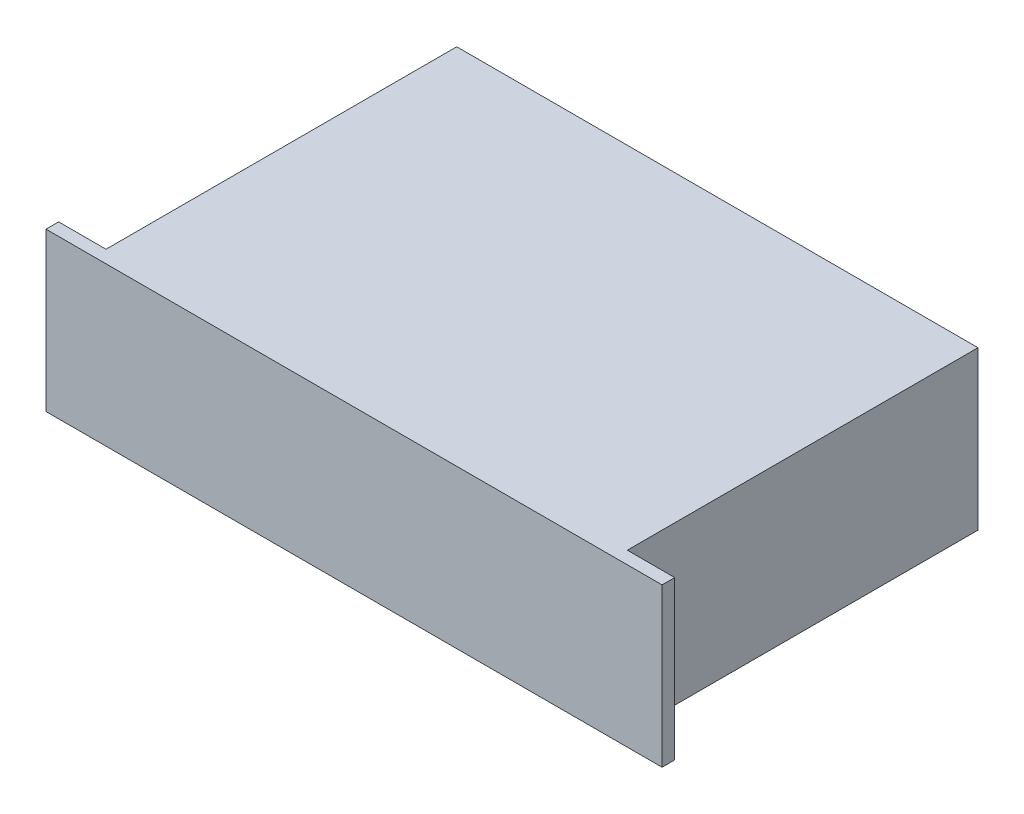
ISO-10303-21;
HEADER;
FILE_DESCRIPTION(('STEP AP214'),'2;1');
FILE_NAME('part.step','',(''),(''),'','','');
FILE_SCHEMA(('AUTOMOTIVE_DESIGN { 1 0 10303 214 1 1 1 1 }'));
ENDSEC;
DATA;
#1=APPLICATION_CONTEXT('core data for automotive mechanical design processes');
#2=APPLICATION_PROTOCOL_DEFINITION('international standard','automotive_design',2000,#1);
#3=PRODUCT_CONTEXT('',#1,'mechanical');
#4=PRODUCT('Part','Part','',(#3));
#5=PRODUCT_RELATED_PRODUCT_CATEGORY('part','',(#4));
#6=PRODUCT_DEFINITION_FORMATION('','',#4);
#7=PRODUCT_DEFINITION_CONTEXT('part definition',#1,'design');
#8=PRODUCT_DEFINITION('design','',#6,#7);
#9=PRODUCT_DEFINITION_SHAPE('','',#8);
#10=(LENGTH_UNIT() NAMED_UNIT(*) SI_UNIT(.MILLI.,.METRE.));
#11=(NAMED_UNIT(*) PLANE_ANGLE_UNIT() SI_UNIT($,.RADIAN.));
#12=(NAMED_UNIT(*) SI_UNIT($,.STERADIAN.) SOLID_ANGLE_UNIT());
#13=UNCERTAINTY_MEASURE_WITH_UNIT(LENGTH_MEASURE(1.E-05),#10,'distance_accuracy_value','');
#14=(GEOMETRIC_REPRESENTATION_CONTEXT(3) GLOBAL_UNCERTAINTY_ASSIGNED_CONTEXT((#13)) GLOBAL_UNIT_ASSIGNED_CONTEXT((#10,
#11,#12)) REPRESENTATION_CONTEXT('',''));
#15=CARTESIAN_POINT('',(0.,0.,0.));
#16=DIRECTION('',(0.,0.,1.));
#17=DIRECTION('',(1.,0.,0.));
#18=AXIS2_PLACEMENT_3D('',#15,#16,#17);
#19=CARTESIAN_POINT('',(0.,0.,0.));
#20=DIRECTION('',(0.,0.,1.));
#21=DIRECTION('',(1.,0.,0.));
#22=AXIS2_PLACEMENT_3D('',#19,#20,#21);
#23=PLANE('',#22);
#24=DIRECTION('',(0.,1.,0.));
#25=VECTOR('',#24,1.);
#26=CARTESIAN_POINT('',(15.,-50.,0.));
#27=LINE('',#26,#25);
#28=CARTESIAN_POINT('',(15.,-50.,0.));
#29=VERTEX_POINT('',#28);
#30=CARTESIAN_POINT('',(15.,0.,0.));
#31=VERTEX_POINT('',#30);
#32=EDGE_CURVE('E60',#29,#31,#27,.T.);
#33=ORIENTED_EDGE('',*,*,#32,.F.);
#34=DIRECTION('',(1.,0.,0.));
#35=VECTOR('',#34,1.);
#36=CARTESIAN_POINT('',(0.,-50.,0.));
#37=LINE('',#36,#35);
#38=CARTESIAN_POINT('',(0.,-50.,0.));
#39=VERTEX_POINT('',#38);
#40=EDGE_CURVE('E204',#39,#29,#37,.T.);
#41=ORIENTED_EDGE('',*,*,#40,.F.);
#42=DIRECTION('',(0.,-1.,0.));
#43=VECTOR('',#42,1.);
#44=CARTESIAN_POINT('',(0.,0.,0.));
#45=LINE('',#44,#43);
#46=CARTESIAN_POINT('',(0.,0.,0.));
#47=VERTEX_POINT('',#46);
#48=EDGE_CURVE('E189',#47,#39,#45,.T.);
#49=ORIENTED_EDGE('',*,*,#48,.F.);
#50=DIRECTION('',(-1.,0.,0.));
#51=VECTOR('',#50,1.);
#52=CARTESIAN_POINT('',(0.,0.,0.));
#53=LINE('',#52,#51);
#54=EDGE_CURVE('E208',#31,#47,#53,.T.);
#55=ORIENTED_EDGE('',*,*,#54,.F.);
#56=EDGE_LOOP('',(#33,#41,#49,#55));
#57=FACE_BOUND('',#56,.T.);
#58=ADVANCED_FACE('F37',(#57),#23,.F.);
#59=DIRECTION('',(0.,-1.,0.));
#60=VECTOR('',#59,1.);
#61=CARTESIAN_POINT('',(180.,-50.,0.));
#62=LINE('',#61,#60);
#63=CARTESIAN_POINT('',(180.,0.,0.));
#64=VERTEX_POINT('',#63);
#65=CARTESIAN_POINT('',(180.,-50.,0.));
#66=VERTEX_POINT('',#65);
#67=EDGE_CURVE('E168',#64,#66,#62,.T.);
#68=ORIENTED_EDGE('',*,*,#67,.F.);
#69=CARTESIAN_POINT('',(195.,0.,0.));
#70=VERTEX_POINT('',#69);
#71=EDGE_CURVE('E194',#70,#64,#53,.T.);
#72=ORIENTED_EDGE('',*,*,#71,.F.);
#73=DIRECTION('',(0.,1.,0.));
#74=VECTOR('',#73,1.);
#75=CARTESIAN_POINT('',(195.,0.,0.));
#76=LINE('',#75,#74);
#77=CARTESIAN_POINT('',(195.,-50.,0.));
#78=VERTEX_POINT('',#77);
#79=EDGE_CURVE('E206',#78,#70,#76,.T.);
#80=ORIENTED_EDGE('',*,*,#79,.F.);
#81=EDGE_CURVE('E203',#66,#78,#37,.T.);
#82=ORIENTED_EDGE('',*,*,#81,.F.);
#83=EDGE_LOOP('',(#68,#72,#80,#82));
#84=FACE_BOUND('',#83,.T.);
#85=ADVANCED_FACE('F225',(#84),#23,.F.);
#86=CARTESIAN_POINT('',(0.,0.,4.));
#87=DIRECTION('',(1.,0.,0.));
#88=DIRECTION('',(0.,0.,-1.));
#89=AXIS2_PLACEMENT_3D('',#86,#87,#88);
#90=PLANE('',#89);
#91=ORIENTED_EDGE('',*,*,#48,.T.);
#92=DIRECTION('',(0.,0.,-1.));
#93=VECTOR('',#92,1.);
#94=CARTESIAN_POINT('',(0.,-50.,4.));
#95=LINE('',#94,#93);
#96=CARTESIAN_POINT('',(0.,-50.,4.));
#97=VERTEX_POINT('',#96);
#98=EDGE_CURVE('E11',#97,#39,#95,.T.);
#99=ORIENTED_EDGE('',*,*,#98,.F.);
#100=DIRECTION('',(0.,-1.,0.));
#101=VECTOR('',#100,1.);
#102=CARTESIAN_POINT('',(0.,0.,4.));
#103=LINE('',#102,#101);
#104=CARTESIAN_POINT('',(0.,0.,4.));
#105=VERTEX_POINT('',#104);
#106=EDGE_CURVE('E190',#105,#97,#103,.T.);
#107=ORIENTED_EDGE('',*,*,#106,.F.);
#108=DIRECTION('',(0.,0.,-1.));
#109=VECTOR('',#108,1.);
#110=CARTESIAN_POINT('',(0.,0.,4.));
#111=LINE('',#110,#109);
#112=EDGE_CURVE('E200',#105,#47,#111,.T.);
#113=ORIENTED_EDGE('',*,*,#112,.T.);
#114=EDGE_LOOP('',(#91,#99,#107,#113));
#115=FACE_BOUND('',#114,.T.);
#116=ADVANCED_FACE('F39',(#115),#90,.F.);
#117=CARTESIAN_POINT('',(0.,-50.,4.));
#118=DIRECTION('',(0.,1.,0.));
#119=DIRECTION('',(0.,0.,1.));
#120=AXIS2_PLACEMENT_3D('',#117,#118,#119);
#121=PLANE('',#120);
#122=ORIENTED_EDGE('',*,*,#40,.T.);
#123=DIRECTION('',(0.,0.,1.));
#124=VECTOR('',#123,1.);
#125=CARTESIAN_POINT('',(15.,-50.,-111.));
#126=LINE('',#125,#124);
#127=CARTESIAN_POINT('',(15.,-50.,-111.));
#128=VERTEX_POINT('',#127);
#129=EDGE_CURVE('E174',#128,#29,#126,.T.);
#130=ORIENTED_EDGE('',*,*,#129,.F.);
#131=DIRECTION('',(-1.,0.,0.));
#132=VECTOR('',#131,1.);
#133=CARTESIAN_POINT('',(180.,-50.,-111.));
#134=LINE('',#133,#132);
#135=CARTESIAN_POINT('',(180.,-50.,-111.));
#136=VERTEX_POINT('',#135);
#137=EDGE_CURVE('E172',#136,#128,#134,.T.);
#138=ORIENTED_EDGE('',*,*,#137,.F.);
#139=DIRECTION('',(0.,0.,1.));
#140=VECTOR('',#139,1.);
#141=CARTESIAN_POINT('',(180.,-50.,-111.));
#142=LINE('',#141,#140);
#143=EDGE_CURVE('E180',#136,#66,#142,.T.);
#144=ORIENTED_EDGE('',*,*,#143,.T.);
#145=ORIENTED_EDGE('',*,*,#81,.T.);
#146=DIRECTION('',(0.,0.,-1.));
#147=VECTOR('',#146,1.);
#148=CARTESIAN_POINT('',(195.,-50.,4.));
#149=LINE('',#148,#147);
#150=CARTESIAN_POINT('',(195.,-50.,4.));
#151=VERTEX_POINT('',#150);
#152=EDGE_CURVE('E45',#151,#78,#149,.T.);
#153=ORIENTED_EDGE('',*,*,#152,.F.);
#154=DIRECTION('',(1.,0.,0.));
#155=VECTOR('',#154,1.);
#156=CARTESIAN_POINT('',(0.,-50.,4.));
#157=LINE('',#156,#155);
#158=EDGE_CURVE('E193',#97,#151,#157,.T.);
#159=ORIENTED_EDGE('',*,*,#158,.F.);
#160=ORIENTED_EDGE('',*,*,#98,.T.);
#161=EDGE_LOOP('',(#122,#130,#138,#144,#145,#153,#159,#160));
#162=FACE_BOUND('',#161,.T.);
#163=ADVANCED_FACE('F243',(#162),#121,.F.);
#164=CARTESIAN_POINT('',(195.,0.,4.));
#165=DIRECTION('',(-1.,0.,0.));
#166=DIRECTION('',(0.,0.,1.));
#167=AXIS2_PLACEMENT_3D('',#164,#165,#166);
#168=PLANE('',#167);
#169=ORIENTED_EDGE('',*,*,#79,.T.);
#170=DIRECTION('',(0.,0.,-1.));
#171=VECTOR('',#170,1.);
#172=CARTESIAN_POINT('',(195.,0.,4.));
#173=LINE('',#172,#171);
#174=CARTESIAN_POINT('',(195.,0.,4.));
#175=VERTEX_POINT('',#174);
#176=EDGE_CURVE('E213',#175,#70,#173,.T.);
#177=ORIENTED_EDGE('',*,*,#176,.F.);
#178=DIRECTION('',(0.,1.,0.));
#179=VECTOR('',#178,1.);
#180=CARTESIAN_POINT('',(195.,0.,4.));
#181=LINE('',#180,#179);
#182=EDGE_CURVE('E196',#151,#175,#181,.T.);
#183=ORIENTED_EDGE('',*,*,#182,.F.);
#184=ORIENTED_EDGE('',*,*,#152,.T.);
#185=EDGE_LOOP('',(#169,#177,#183,#184));
#186=FACE_BOUND('',#185,.T.);
#187=ADVANCED_FACE('F220',(#186),#168,.F.);
#188=CARTESIAN_POINT('',(0.,0.,4.));
#189=DIRECTION('',(0.,-1.,0.));
#190=DIRECTION('',(0.,0.,-1.));
#191=AXIS2_PLACEMENT_3D('',#188,#189,#190);
#192=PLANE('',#191);
#193=ORIENTED_EDGE('',*,*,#71,.T.);
#194=DIRECTION('',(0.,0.,1.));
#195=VECTOR('',#194,1.);
#196=CARTESIAN_POINT('',(180.,0.,-111.));
#197=LINE('',#196,#195);
#198=CARTESIAN_POINT('',(180.,0.,-111.));
#199=VERTEX_POINT('',#198);
#200=EDGE_CURVE('E183',#199,#64,#197,.T.);
#201=ORIENTED_EDGE('',*,*,#200,.F.);
#202=DIRECTION('',(1.,0.,0.));
#203=VECTOR('',#202,1.);
#204=CARTESIAN_POINT('',(180.,0.,-111.));
#205=LINE('',#204,#203);
#206=CARTESIAN_POINT('',(15.,0.,-111.));
#207=VERTEX_POINT('',#206);
#208=EDGE_CURVE('E167',#207,#199,#205,.T.);
#209=ORIENTED_EDGE('',*,*,#208,.F.);
#210=DIRECTION('',(0.,0.,1.));
#211=VECTOR('',#210,1.);
#212=CARTESIAN_POINT('',(15.,0.,-111.));
#213=LINE('',#212,#211);
#214=EDGE_CURVE('E186',#207,#31,#213,.T.);
#215=ORIENTED_EDGE('',*,*,#214,.T.);
#216=ORIENTED_EDGE('',*,*,#54,.T.);
#217=ORIENTED_EDGE('',*,*,#112,.F.);
#218=DIRECTION('',(-1.,0.,0.));
#219=VECTOR('',#218,1.);
#220=CARTESIAN_POINT('',(0.,0.,4.));
#221=LINE('',#220,#219);
#222=EDGE_CURVE('E198',#175,#105,#221,.T.);
#223=ORIENTED_EDGE('',*,*,#222,.F.);
#224=ORIENTED_EDGE('',*,*,#176,.T.);
#225=EDGE_LOOP('',(#193,#201,#209,#215,#216,#217,#223,#224));
#226=FACE_BOUND('',#225,.T.);
#227=ADVANCED_FACE('F228',(#226),#192,.F.);
#228=CARTESIAN_POINT('',(0.,0.,4.));
#229=DIRECTION('',(0.,0.,1.));
#230=DIRECTION('',(1.,0.,0.));
#231=AXIS2_PLACEMENT_3D('',#228,#229,#230);
#232=PLANE('',#231);
#233=ORIENTED_EDGE('',*,*,#106,.T.);
#234=ORIENTED_EDGE('',*,*,#158,.T.);
#235=ORIENTED_EDGE('',*,*,#182,.T.);
#236=ORIENTED_EDGE('',*,*,#222,.T.);
#237=EDGE_LOOP('',(#233,#234,#235,#236));
#238=FACE_BOUND('',#237,.T.);
#239=ADVANCED_FACE('F249',(#238),#232,.T.);
#240=CARTESIAN_POINT('',(15.,-50.,-111.));
#241=DIRECTION('',(1.,0.,0.));
#242=DIRECTION('',(0.,0.,-1.));
#243=AXIS2_PLACEMENT_3D('',#240,#241,#242);
#244=PLANE('',#243);
#245=ORIENTED_EDGE('',*,*,#32,.T.);
#246=ORIENTED_EDGE('',*,*,#214,.F.);
#247=DIRECTION('',(0.,1.,0.));
#248=VECTOR('',#247,1.);
#249=CARTESIAN_POINT('',(15.,-50.,-111.));
#250=LINE('',#249,#248);
#251=EDGE_CURVE('E164',#128,#207,#250,.T.);
#252=ORIENTED_EDGE('',*,*,#251,.F.);
#253=ORIENTED_EDGE('',*,*,#129,.T.);
#254=EDGE_LOOP('',(#245,#246,#252,#253));
#255=FACE_BOUND('',#254,.T.);
#256=ADVANCED_FACE('F242',(#255),#244,.F.);
#257=CARTESIAN_POINT('',(180.,-50.,-111.));
#258=DIRECTION('',(-1.,0.,0.));
#259=DIRECTION('',(0.,0.,1.));
#260=AXIS2_PLACEMENT_3D('',#257,#258,#259);
#261=PLANE('',#260);
#262=ORIENTED_EDGE('',*,*,#67,.T.);
#263=ORIENTED_EDGE('',*,*,#143,.F.);
#264=DIRECTION('',(0.,-1.,0.));
#265=VECTOR('',#264,1.);
#266=CARTESIAN_POINT('',(180.,-50.,-111.));
#267=LINE('',#266,#265);
#268=EDGE_CURVE('E170',#199,#136,#267,.T.);
#269=ORIENTED_EDGE('',*,*,#268,.F.);
#270=ORIENTED_EDGE('',*,*,#200,.T.);
#271=EDGE_LOOP('',(#262,#263,#269,#270));
#272=FACE_BOUND('',#271,.T.);
#273=ADVANCED_FACE('F232',(#272),#261,.F.);
#274=CARTESIAN_POINT('',(0.,0.,-111.));
#275=DIRECTION('',(0.,0.,1.));
#276=DIRECTION('',(1.,0.,0.));
#277=AXIS2_PLACEMENT_3D('',#274,#275,#276);
#278=PLANE('',#277);
#279=DIRECTION('',(1.,0.,0.));
#280=VECTOR('',#279,1.);
#281=CARTESIAN_POINT('',(142.628697495827,-19.4348018783169,-111.));
#282=LINE('',#281,#280);
#283=CARTESIAN_POINT('',(52.3713025041732,-19.4348018783169,-111.));
#284=VERTEX_POINT('',#283);
#285=CARTESIAN_POINT('',(142.628697495827,-19.4348018783169,-111.));
#286=VERTEX_POINT('',#285);
#287=EDGE_CURVE('E155',#284,#286,#282,.T.);
#288=ORIENTED_EDGE('',*,*,#287,.F.);
#289=DIRECTION('',(0.,1.,0.));
#290=VECTOR('',#289,1.);
#291=CARTESIAN_POINT('',(52.3713025041732,-30.5651981216831,-111.));
#292=LINE('',#291,#290);
#293=CARTESIAN_POINT('',(52.3713025041732,-30.5651981216831,-111.));
#294=VERTEX_POINT('',#293);
#295=EDGE_CURVE('E52',#294,#284,#292,.T.);
#296=ORIENTED_EDGE('',*,*,#295,.F.);
#297=DIRECTION('',(-1.,0.,0.));
#298=VECTOR('',#297,1.);
#299=CARTESIAN_POINT('',(142.628697495827,-30.5651981216831,-111.));
#300=LINE('',#299,#298);
#301=CARTESIAN_POINT('',(142.628697495827,-30.5651981216831,-111.));
#302=VERTEX_POINT('',#301);
#303=EDGE_CURVE('E146',#302,#294,#300,.T.);
#304=ORIENTED_EDGE('',*,*,#303,.F.);
#305=DIRECTION('',(0.,-1.,0.));
#306=VECTOR('',#305,1.);
#307=CARTESIAN_POINT('',(142.628697495827,-30.5651981216831,-111.));
#308=LINE('',#307,#306);
#309=EDGE_CURVE('E149',#286,#302,#308,.T.);
#310=ORIENTED_EDGE('',*,*,#309,.F.);
#311=EDGE_LOOP('',(#288,#296,#304,#310));
#312=FACE_BOUND('',#311,.T.);
#313=ORIENTED_EDGE('',*,*,#251,.T.);
#314=ORIENTED_EDGE('',*,*,#208,.T.);
#315=ORIENTED_EDGE('',*,*,#268,.T.);
#316=ORIENTED_EDGE('',*,*,#137,.T.);
#317=EDGE_LOOP('',(#313,#314,#315,#316));
#318=FACE_BOUND('',#317,.T.);
#319=ADVANCED_FACE('F236',(#312,#318),#278,.F.);
#320=CARTESIAN_POINT('',(52.3713025041732,-30.5651981216831,-101.));
#321=DIRECTION('',(-1.,0.,0.));
#322=DIRECTION('',(0.,0.,1.));
#323=AXIS2_PLACEMENT_3D('',#320,#321,#322);
#324=PLANE('',#323);
#325=ORIENTED_EDGE('',*,*,#295,.T.);
#326=DIRECTION('',(0.,0.,-1.));
#327=VECTOR('',#326,1.);
#328=CARTESIAN_POINT('',(52.3713025041732,-19.4348018783169,-101.));
#329=LINE('',#328,#327);
#330=CARTESIAN_POINT('',(52.3713025041732,-19.4348018783169,-101.));
#331=VERTEX_POINT('',#330);
#332=EDGE_CURVE('E124',#331,#284,#329,.T.);
#333=ORIENTED_EDGE('',*,*,#332,.F.);
#334=DIRECTION('',(0.,1.,0.));
#335=VECTOR('',#334,1.);
#336=CARTESIAN_POINT('',(52.3713025041732,-30.5651981216831,-101.));
#337=LINE('',#336,#335);
#338=CARTESIAN_POINT('',(52.3713025041732,-30.5651981216831,-101.));
#339=VERTEX_POINT('',#338);
#340=EDGE_CURVE('E128',#339,#331,#337,.T.);
#341=ORIENTED_EDGE('',*,*,#340,.F.);
#342=DIRECTION('',(0.,0.,-1.));
#343=VECTOR('',#342,1.);
#344=CARTESIAN_POINT('',(52.3713025041732,-30.5651981216831,-101.));
#345=LINE('',#344,#343);
#346=EDGE_CURVE('E159',#339,#294,#345,.T.);
#347=ORIENTED_EDGE('',*,*,#346,.T.);
#348=EDGE_LOOP('',(#325,#333,#341,#347));
#349=FACE_BOUND('',#348,.T.);
#350=ADVANCED_FACE('F126',(#349),#324,.F.);
#351=CARTESIAN_POINT('',(142.628697495827,-30.5651981216831,-101.));
#352=DIRECTION('',(0.,-1.,0.));
#353=DIRECTION('',(0.,0.,-1.));
#354=AXIS2_PLACEMENT_3D('',#351,#352,#353);
#355=PLANE('',#354);
#356=ORIENTED_EDGE('',*,*,#303,.T.);
#357=ORIENTED_EDGE('',*,*,#346,.F.);
#358=DIRECTION('',(-1.,0.,0.));
#359=VECTOR('',#358,1.);
#360=CARTESIAN_POINT('',(142.628697495827,-30.5651981216831,-101.));
#361=LINE('',#360,#359);
#362=CARTESIAN_POINT('',(142.628697495827,-30.5651981216831,-101.));
#363=VERTEX_POINT('',#362);
#364=EDGE_CURVE('E134',#363,#339,#361,.T.);
#365=ORIENTED_EDGE('',*,*,#364,.F.);
#366=DIRECTION('',(0.,0.,-1.));
#367=VECTOR('',#366,1.);
#368=CARTESIAN_POINT('',(142.628697495827,-30.5651981216831,-101.));
#369=LINE('',#368,#367);
#370=EDGE_CURVE('E161',#363,#302,#369,.T.);
#371=ORIENTED_EDGE('',*,*,#370,.T.);
#372=EDGE_LOOP('',(#356,#357,#365,#371));
#373=FACE_BOUND('',#372,.T.);
#374=ADVANCED_FACE('F323',(#373),#355,.F.);
#375=CARTESIAN_POINT('',(142.628697495827,-30.5651981216831,-101.));
#376=DIRECTION('',(1.,0.,0.));
#377=DIRECTION('',(0.,0.,-1.));
#378=AXIS2_PLACEMENT_3D('',#375,#376,#377);
#379=PLANE('',#378);
#380=ORIENTED_EDGE('',*,*,#309,.T.);
#381=ORIENTED_EDGE('',*,*,#370,.F.);
#382=DIRECTION('',(0.,-1.,0.));
#383=VECTOR('',#382,1.);
#384=CARTESIAN_POINT('',(142.628697495827,-30.5651981216831,-101.));
#385=LINE('',#384,#383);
#386=CARTESIAN_POINT('',(142.628697495827,-19.4348018783169,-101.));
#387=VERTEX_POINT('',#386);
#388=EDGE_CURVE('E142',#387,#363,#385,.T.);
#389=ORIENTED_EDGE('',*,*,#388,.F.);
#390=DIRECTION('',(0.,0.,-1.));
#391=VECTOR('',#390,1.);
#392=CARTESIAN_POINT('',(142.628697495827,-19.4348018783169,-101.));
#393=LINE('',#392,#391);
#394=EDGE_CURVE('E133',#387,#286,#393,.T.);
#395=ORIENTED_EDGE('',*,*,#394,.T.);
#396=EDGE_LOOP('',(#380,#381,#389,#395));
#397=FACE_BOUND('',#396,.T.);
#398=ADVANCED_FACE('F332',(#397),#379,.F.);
#399=CARTESIAN_POINT('',(142.628697495827,-19.4348018783169,-101.));
#400=DIRECTION('',(0.,1.,0.));
#401=DIRECTION('',(0.,0.,1.));
#402=AXIS2_PLACEMENT_3D('',#399,#400,#401);
#403=PLANE('',#402);
#404=ORIENTED_EDGE('',*,*,#287,.T.);
#405=ORIENTED_EDGE('',*,*,#394,.F.);
#406=DIRECTION('',(1.,0.,0.));
#407=VECTOR('',#406,1.);
#408=CARTESIAN_POINT('',(142.628697495827,-19.4348018783169,-101.));
#409=LINE('',#408,#407);
#410=EDGE_CURVE('E137',#331,#387,#409,.T.);
#411=ORIENTED_EDGE('',*,*,#410,.F.);
#412=ORIENTED_EDGE('',*,*,#332,.T.);
#413=EDGE_LOOP('',(#404,#405,#411,#412));
#414=FACE_BOUND('',#413,.T.);
#415=ADVANCED_FACE('F138',(#414),#403,.F.);
#416=CARTESIAN_POINT('',(0.,0.,-101.));
#417=DIRECTION('',(0.,0.,1.));
#418=DIRECTION('',(1.,0.,0.));
#419=AXIS2_PLACEMENT_3D('',#416,#417,#418);
#420=PLANE('',#419);
#421=ORIENTED_EDGE('',*,*,#340,.T.);
#422=ORIENTED_EDGE('',*,*,#410,.T.);
#423=ORIENTED_EDGE('',*,*,#388,.T.);
#424=ORIENTED_EDGE('',*,*,#364,.T.);
#425=EDGE_LOOP('',(#421,#422,#423,#424));
#426=FACE_BOUND('',#425,.T.);
#427=ADVANCED_FACE('F144',(#426),#420,.F.);
#428=CLOSED_SHELL('',(#58,#85,#116,#163,#187,#227,#239,#256,#273,#319,#350,#374,#398,#415,#427));
#429=MANIFOLD_SOLID_BREP('B2',#428);
#430=ADVANCED_BREP_SHAPE_REPRESENTATION('',(#18,#429),#14);
#431=SHAPE_DEFINITION_REPRESENTATION(#9,#430);
ENDSEC;
END-ISO-10303-21;
